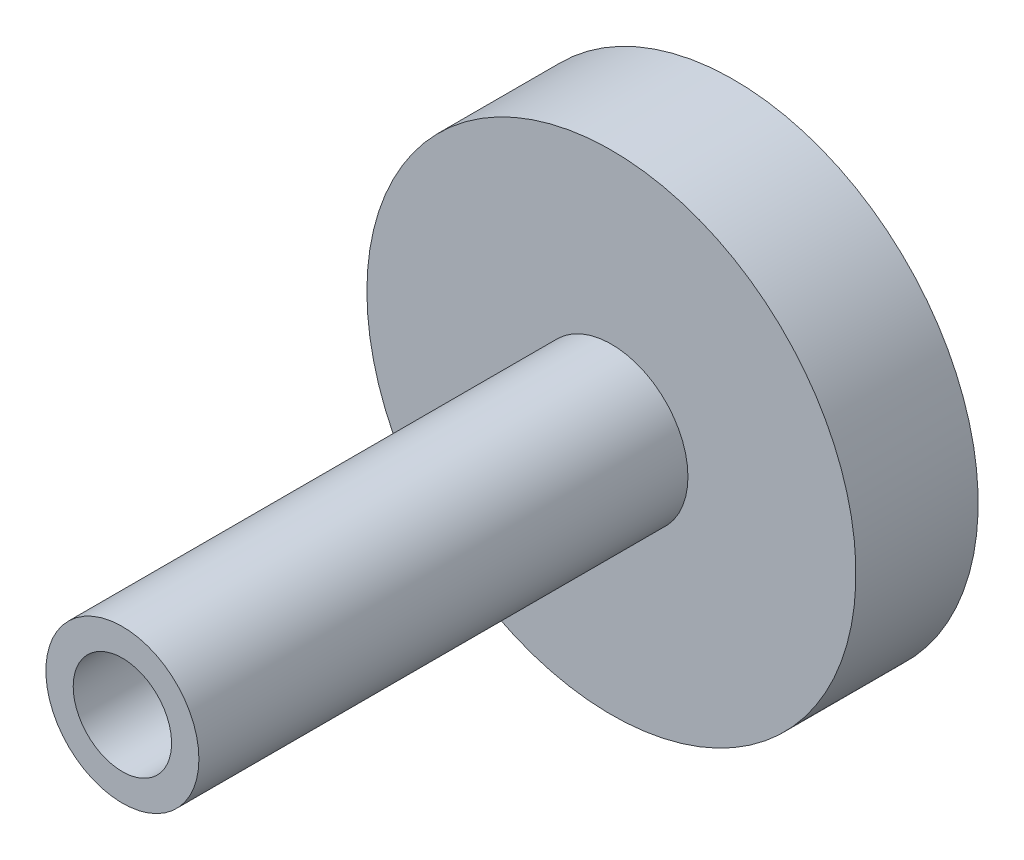
ISO-10303-21;
HEADER;
FILE_DESCRIPTION(('STEP AP214'),'2;1');
FILE_NAME('part.step','',(''),(''),'','','');
FILE_SCHEMA(('AUTOMOTIVE_DESIGN { 1 0 10303 214 1 1 1 1 }'));
ENDSEC;
DATA;
#1=APPLICATION_CONTEXT('core data for automotive mechanical design processes');
#2=APPLICATION_PROTOCOL_DEFINITION('international standard','automotive_design',2000,#1);
#3=PRODUCT_CONTEXT('',#1,'mechanical');
#4=PRODUCT('Part','Part','',(#3));
#5=PRODUCT_RELATED_PRODUCT_CATEGORY('part','',(#4));
#6=PRODUCT_DEFINITION_FORMATION('','',#4);
#7=PRODUCT_DEFINITION_CONTEXT('part definition',#1,'design');
#8=PRODUCT_DEFINITION('design','',#6,#7);
#9=PRODUCT_DEFINITION_SHAPE('','',#8);
#10=(LENGTH_UNIT() NAMED_UNIT(*) SI_UNIT(.MILLI.,.METRE.));
#11=(NAMED_UNIT(*) PLANE_ANGLE_UNIT() SI_UNIT($,.RADIAN.));
#12=(NAMED_UNIT(*) SI_UNIT($,.STERADIAN.) SOLID_ANGLE_UNIT());
#13=UNCERTAINTY_MEASURE_WITH_UNIT(LENGTH_MEASURE(1.E-05),#10,'distance_accuracy_value','');
#14=(GEOMETRIC_REPRESENTATION_CONTEXT(3) GLOBAL_UNCERTAINTY_ASSIGNED_CONTEXT((#13)) GLOBAL_UNIT_ASSIGNED_CONTEXT((#10,
#11,#12)) REPRESENTATION_CONTEXT('',''));
#15=CARTESIAN_POINT('',(0.,0.,0.));
#16=DIRECTION('',(0.,0.,1.));
#17=DIRECTION('',(1.,0.,0.));
#18=AXIS2_PLACEMENT_3D('',#15,#16,#17);
#19=CARTESIAN_POINT('',(0.,0.,31.7499999999997));
#20=DIRECTION('',(0.,0.,0.999999999999995));
#21=DIRECTION('',(1.,0.,0.));
#22=AXIS2_PLACEMENT_3D('',#19,#20,#21);
#23=PLANE('',#22);
#24=CARTESIAN_POINT('',(0.,0.,31.7499999999997));
#25=DIRECTION('',(0.,0.,0.999999999999995));
#26=DIRECTION('',(1.,0.,0.));
#27=AXIS2_PLACEMENT_3D('',#24,#25,#26);
#28=CIRCLE('',#27,2.555);
#29=CARTESIAN_POINT('',(-2.55500000000001,0.,31.7499999999997));
#30=VERTEX_POINT('',#29);
#31=EDGE_CURVE('E43',#30,#30,#28,.T.);
#32=ORIENTED_EDGE('',*,*,#31,.F.);
#33=EDGE_LOOP('',(#32));
#34=FACE_BOUND('',#33,.T.);
#35=CARTESIAN_POINT('',(0.,0.,31.7499999999997));
#36=DIRECTION('',(0.,0.,0.999999999999995));
#37=DIRECTION('',(1.,0.,0.));
#38=AXIS2_PLACEMENT_3D('',#35,#36,#37);
#39=CIRCLE('',#38,3.9751);
#40=CARTESIAN_POINT('',(3.97510000000002,0.,31.7499999999997));
#41=VERTEX_POINT('',#40);
#42=EDGE_CURVE('E57',#41,#41,#39,.T.);
#43=ORIENTED_EDGE('',*,*,#42,.T.);
#44=EDGE_LOOP('',(#43));
#45=FACE_BOUND('',#44,.T.);
#46=ADVANCED_FACE('F36',(#34,#45),#23,.T.);
#47=CARTESIAN_POINT('',(0.,0.,31.7499999999997));
#48=DIRECTION('',(0.,0.,-0.999999999999995));
#49=DIRECTION('',(-1.,0.,0.));
#50=AXIS2_PLACEMENT_3D('',#47,#48,#49);
#51=CYLINDRICAL_SURFACE('',#50,12.7);
#52=CARTESIAN_POINT('',(0.,0.,0.));
#53=DIRECTION('',(0.,0.,0.999999999999995));
#54=DIRECTION('',(1.,0.,0.));
#55=AXIS2_PLACEMENT_3D('',#52,#53,#54);
#56=CIRCLE('',#55,12.7);
#57=CARTESIAN_POINT('',(-12.7000000000001,0.,0.));
#58=VERTEX_POINT('',#57);
#59=EDGE_CURVE('E10',#58,#58,#56,.T.);
#60=CARTESIAN_POINT('',(0.,0.,6.34999999999999));
#61=DIRECTION('',(0.,0.,0.999999999999995));
#62=DIRECTION('',(1.,0.,0.));
#63=AXIS2_PLACEMENT_3D('',#60,#61,#62);
#64=CIRCLE('',#63,12.7);
#65=CARTESIAN_POINT('',(-12.7000000000001,0.,6.34999999999999));
#66=VERTEX_POINT('',#65);
#67=EDGE_CURVE('E52',#66,#66,#64,.T.);
#68=CARTESIAN_POINT('',(-12.7000000000001,0.,0.));
#69=CARTESIAN_POINT('',(-12.7000000000001,0.,0.0661458333333341));
#70=CARTESIAN_POINT('',(-12.7000000000001,0.,0.132291666666668));
#71=CARTESIAN_POINT('',(-12.7000000000001,0.,0.264583333333337));
#72=CARTESIAN_POINT('',(-12.7000000000001,0.,0.330729166666671));
#73=CARTESIAN_POINT('',(-12.7000000000001,0.,0.463020833333337));
#74=CARTESIAN_POINT('',(-12.7000000000001,0.,0.529166666666668));
#75=CARTESIAN_POINT('',(-12.7000000000001,0.,0.661458333333334));
#76=CARTESIAN_POINT('',(-12.7000000000001,0.,0.727604166666669));
#77=CARTESIAN_POINT('',(-12.7000000000001,0.,0.859895833333336));
#78=CARTESIAN_POINT('',(-12.7000000000001,0.,0.926041666666669));
#79=CARTESIAN_POINT('',(-12.7000000000001,0.,1.05833333333333));
#80=CARTESIAN_POINT('',(-12.7000000000001,0.,1.12447916666667));
#81=CARTESIAN_POINT('',(-12.7000000000001,0.,1.25677083333333));
#82=CARTESIAN_POINT('',(-12.7000000000001,0.,1.32291666666667));
#83=CARTESIAN_POINT('',(-12.7000000000001,0.,1.45520833333333));
#84=CARTESIAN_POINT('',(-12.7000000000001,0.,1.52135416666667));
#85=CARTESIAN_POINT('',(-12.7000000000001,0.,1.65364583333333));
#86=CARTESIAN_POINT('',(-12.7000000000001,0.,1.71979166666667));
#87=CARTESIAN_POINT('',(-12.7000000000001,0.,1.85208333333333));
#88=CARTESIAN_POINT('',(-12.7000000000001,0.,1.91822916666667));
#89=CARTESIAN_POINT('',(-12.7000000000001,0.,2.05052083333333));
#90=CARTESIAN_POINT('',(-12.7000000000001,0.,2.11666666666666));
#91=CARTESIAN_POINT('',(-12.7000000000001,0.,2.24895833333333));
#92=CARTESIAN_POINT('',(-12.7000000000001,0.,2.31510416666666));
#93=CARTESIAN_POINT('',(-12.7000000000001,0.,2.44739583333333));
#94=CARTESIAN_POINT('',(-12.7000000000001,0.,2.51354166666667));
#95=CARTESIAN_POINT('',(-12.7000000000001,0.,2.64583333333333));
#96=CARTESIAN_POINT('',(-12.7000000000001,0.,2.71197916666667));
#97=CARTESIAN_POINT('',(-12.7000000000001,0.,2.84427083333333));
#98=CARTESIAN_POINT('',(-12.7000000000001,0.,2.91041666666666));
#99=CARTESIAN_POINT('',(-12.7000000000001,0.,3.04270833333333));
#100=CARTESIAN_POINT('',(-12.7000000000001,0.,3.10885416666666));
#101=CARTESIAN_POINT('',(-12.7000000000001,0.,3.24114583333333));
#102=CARTESIAN_POINT('',(-12.7000000000001,0.,3.30729166666667));
#103=CARTESIAN_POINT('',(-12.7000000000001,0.,3.43958333333333));
#104=CARTESIAN_POINT('',(-12.7000000000001,0.,3.50572916666666));
#105=CARTESIAN_POINT('',(-12.7000000000001,0.,3.63802083333333));
#106=CARTESIAN_POINT('',(-12.7000000000001,0.,3.70416666666666));
#107=CARTESIAN_POINT('',(-12.7000000000001,0.,3.83645833333333));
#108=CARTESIAN_POINT('',(-12.7000000000001,0.,3.90260416666666));
#109=CARTESIAN_POINT('',(-12.7000000000001,0.,4.03489583333333));
#110=CARTESIAN_POINT('',(-12.7000000000001,0.,4.10104166666666));
#111=CARTESIAN_POINT('',(-12.7000000000001,0.,4.23333333333333));
#112=CARTESIAN_POINT('',(-12.7000000000001,0.,4.29947916666666));
#113=CARTESIAN_POINT('',(-12.7000000000001,0.,4.43177083333333));
#114=CARTESIAN_POINT('',(-12.7000000000001,0.,4.49791666666666));
#115=CARTESIAN_POINT('',(-12.7000000000001,0.,4.63020833333333));
#116=CARTESIAN_POINT('',(-12.7000000000001,0.,4.69635416666666));
#117=CARTESIAN_POINT('',(-12.7000000000001,0.,4.82864583333333));
#118=CARTESIAN_POINT('',(-12.7000000000001,0.,4.89479166666666));
#119=CARTESIAN_POINT('',(-12.7000000000001,0.,5.02708333333333));
#120=CARTESIAN_POINT('',(-12.7000000000001,0.,5.09322916666666));
#121=CARTESIAN_POINT('',(-12.7000000000001,0.,5.22552083333333));
#122=CARTESIAN_POINT('',(-12.7000000000001,0.,5.29166666666666));
#123=CARTESIAN_POINT('',(-12.7000000000001,0.,5.42395833333333));
#124=CARTESIAN_POINT('',(-12.7000000000001,0.,5.49010416666666));
#125=CARTESIAN_POINT('',(-12.7000000000001,0.,5.62239583333333));
#126=CARTESIAN_POINT('',(-12.7000000000001,0.,5.68854166666666));
#127=CARTESIAN_POINT('',(-12.7000000000001,0.,5.82083333333333));
#128=CARTESIAN_POINT('',(-12.7000000000001,0.,5.88697916666666));
#129=CARTESIAN_POINT('',(-12.7000000000001,0.,6.01927083333333));
#130=CARTESIAN_POINT('',(-12.7000000000001,0.,6.08541666666666));
#131=CARTESIAN_POINT('',(-12.7000000000001,0.,6.21770833333332));
#132=CARTESIAN_POINT('',(-12.7000000000001,0.,6.28385416666666));
#133=CARTESIAN_POINT('',(-12.7000000000001,0.,6.34999999999999));
#134=B_SPLINE_CURVE_WITH_KNOTS('',3,(#68,#69,#70,#71,#72,#73,#74,#75,#76,#77,#78,#79,#80,#81,
#82,#83,#84,#85,#86,#87,#88,#89,#90,#91,#92,#93,#94,#95,#96,#97,#98,#99,#100,#101,#102,#103,
#104,#105,#106,#107,#108,#109,#110,#111,#112,#113,#114,#115,#116,#117,#118,#119,#120,#121,#122,
#123,#124,#125,#126,#127,#128,#129,#130,#131,#132,#133),.UNSPECIFIED.,.F.,.F.,(4,2,2,2,2,2,2,2,
2,2,2,2,2,2,2,2,2,2,2,2,2,2,2,2,2,2,2,2,2,2,2,2,4),(0.,0.198437500000002,0.396875000000005,
0.5953125,0.793750000000003,0.992187500000002,1.190625,1.3890625,1.5875,1.7859375,1.984375,
2.1828125,2.38125,2.5796875,2.778125,2.97656249999999,3.175,3.3734375,3.571875,3.77031249999999,
3.96875,4.1671875,4.36562499999999,4.56406249999999,4.76249999999999,4.96093749999999,
5.15937499999999,5.35781249999999,5.55624999999999,5.75468749999999,5.95312499999999,
6.15156249999999,6.34999999999999),.UNSPECIFIED.);
#135=EDGE_CURVE('BSEAM38',#58,#66,#134,.T.);
#136=ORIENTED_EDGE('',*,*,#59,.T.);
#137=ORIENTED_EDGE('',*,*,#67,.F.);
#138=ORIENTED_EDGE('',*,*,#135,.T.);
#139=ORIENTED_EDGE('',*,*,#135,.F.);
#140=EDGE_LOOP('',(#136,#138,#137,#139));
#141=FACE_BOUND('',#140,.T.);
#142=ADVANCED_FACE('F38',(#141),#51,.T.);
#143=CARTESIAN_POINT('',(0.,0.,0.));
#144=DIRECTION('',(0.,0.,0.999999999999995));
#145=DIRECTION('',(1.,0.,0.));
#146=AXIS2_PLACEMENT_3D('',#143,#144,#145);
#147=PLANE('',#146);
#148=ORIENTED_EDGE('',*,*,#59,.F.);
#149=EDGE_LOOP('',(#148));
#150=FACE_BOUND('',#149,.T.);
#151=CARTESIAN_POINT('',(0.,0.,0.));
#152=DIRECTION('',(0.,0.,0.999999999999995));
#153=DIRECTION('',(1.,0.,0.));
#154=AXIS2_PLACEMENT_3D('',#151,#152,#153);
#155=CIRCLE('',#154,2.555);
#156=CARTESIAN_POINT('',(-2.55500000000001,0.,0.));
#157=VERTEX_POINT('',#156);
#158=EDGE_CURVE('E47',#157,#157,#155,.T.);
#159=ORIENTED_EDGE('',*,*,#158,.T.);
#160=EDGE_LOOP('',(#159));
#161=FACE_BOUND('',#160,.T.);
#162=ADVANCED_FACE('F74',(#150,#161),#147,.F.);
#163=CARTESIAN_POINT('',(0.,0.,31.7499999999997));
#164=DIRECTION('',(0.,0.,-0.999999999999995));
#165=DIRECTION('',(-1.,0.,0.));
#166=AXIS2_PLACEMENT_3D('',#163,#164,#165);
#167=CYLINDRICAL_SURFACE('',#166,2.555);
#168=CARTESIAN_POINT('',(-2.55500000000001,0.,31.7499999999997));
#169=CARTESIAN_POINT('',(-2.55500000000001,0.,31.419270833333));
#170=CARTESIAN_POINT('',(-2.55500000000001,0.,31.0885416666663));
#171=CARTESIAN_POINT('',(-2.55500000000001,0.,30.427083333333));
#172=CARTESIAN_POINT('',(-2.55500000000001,0.,30.0963541666663));
#173=CARTESIAN_POINT('',(-2.55500000000001,0.,29.434895833333));
#174=CARTESIAN_POINT('',(-2.55500000000001,0.,29.1041666666664));
#175=CARTESIAN_POINT('',(-2.55500000000001,0.,28.442708333333));
#176=CARTESIAN_POINT('',(-2.55500000000001,0.,28.1119791666664));
#177=CARTESIAN_POINT('',(-2.55500000000001,0.,27.450520833333));
#178=CARTESIAN_POINT('',(-2.55500000000001,0.,27.1197916666664));
#179=CARTESIAN_POINT('',(-2.55500000000001,0.,26.4583333333331));
#180=CARTESIAN_POINT('',(-2.55500000000001,0.,26.1276041666664));
#181=CARTESIAN_POINT('',(-2.55500000000001,0.,25.4661458333331));
#182=CARTESIAN_POINT('',(-2.55500000000001,0.,25.1354166666664));
#183=CARTESIAN_POINT('',(-2.55500000000001,0.,24.4739583333331));
#184=CARTESIAN_POINT('',(-2.55500000000001,0.,24.1432291666664));
#185=CARTESIAN_POINT('',(-2.55500000000001,0.,23.4817708333331));
#186=CARTESIAN_POINT('',(-2.55500000000001,0.,23.1510416666664));
#187=CARTESIAN_POINT('',(-2.55500000000001,0.,22.4895833333331));
#188=CARTESIAN_POINT('',(-2.55500000000001,0.,22.1588541666664));
#189=CARTESIAN_POINT('',(-2.55500000000001,0.,21.4973958333331));
#190=CARTESIAN_POINT('',(-2.55500000000001,0.,21.1666666666664));
#191=CARTESIAN_POINT('',(-2.55500000000001,0.,20.5052083333331));
#192=CARTESIAN_POINT('',(-2.55500000000001,0.,20.1744791666665));
#193=CARTESIAN_POINT('',(-2.55500000000001,0.,19.5130208333331));
#194=CARTESIAN_POINT('',(-2.55500000000001,0.,19.1822916666665));
#195=CARTESIAN_POINT('',(-2.55500000000001,0.,18.5208333333331));
#196=CARTESIAN_POINT('',(-2.55500000000001,0.,18.1901041666665));
#197=CARTESIAN_POINT('',(-2.55500000000001,0.,17.5286458333332));
#198=CARTESIAN_POINT('',(-2.55500000000001,0.,17.1979166666665));
#199=CARTESIAN_POINT('',(-2.55500000000001,0.,16.5364583333332));
#200=CARTESIAN_POINT('',(-2.55500000000001,0.,16.2057291666665));
#201=CARTESIAN_POINT('',(-2.55500000000001,0.,15.5442708333332));
#202=CARTESIAN_POINT('',(-2.55500000000001,0.,15.2135416666665));
#203=CARTESIAN_POINT('',(-2.55500000000001,0.,14.5520833333332));
#204=CARTESIAN_POINT('',(-2.55500000000001,0.,14.2213541666665));
#205=CARTESIAN_POINT('',(-2.55500000000001,0.,13.5598958333332));
#206=CARTESIAN_POINT('',(-2.55500000000001,0.,13.2291666666665));
#207=CARTESIAN_POINT('',(-2.55500000000001,0.,12.5677083333332));
#208=CARTESIAN_POINT('',(-2.55500000000001,0.,12.2369791666665));
#209=CARTESIAN_POINT('',(-2.55500000000001,0.,11.5755208333332));
#210=CARTESIAN_POINT('',(-2.55500000000001,0.,11.2447916666666));
#211=CARTESIAN_POINT('',(-2.55500000000001,0.,10.5833333333332));
#212=CARTESIAN_POINT('',(-2.55500000000001,0.,10.2526041666666));
#213=CARTESIAN_POINT('',(-2.55500000000001,0.,9.59114583333324));
#214=CARTESIAN_POINT('',(-2.55500000000001,0.,9.26041666666657));
#215=CARTESIAN_POINT('',(-2.55500000000001,0.,8.59895833333325));
#216=CARTESIAN_POINT('',(-2.55500000000001,0.,8.26822916666659));
#217=CARTESIAN_POINT('',(-2.55500000000001,0.,7.60677083333326));
#218=CARTESIAN_POINT('',(-2.55500000000001,0.,7.2760416666666));
#219=CARTESIAN_POINT('',(-2.55500000000001,0.,6.61458333333327));
#220=CARTESIAN_POINT('',(-2.55500000000001,0.,6.28385416666661));
#221=CARTESIAN_POINT('',(-2.55500000000001,0.,5.62239583333328));
#222=CARTESIAN_POINT('',(-2.55500000000001,0.,5.29166666666662));
#223=CARTESIAN_POINT('',(-2.55500000000001,0.,4.63020833333329));
#224=CARTESIAN_POINT('',(-2.55500000000001,0.,4.29947916666663));
#225=CARTESIAN_POINT('',(-2.55500000000001,0.,3.6380208333333));
#226=CARTESIAN_POINT('',(-2.55500000000001,0.,3.30729166666664));
#227=CARTESIAN_POINT('',(-2.55500000000001,0.,2.64583333333331));
#228=CARTESIAN_POINT('',(-2.55500000000001,0.,2.31510416666665));
#229=CARTESIAN_POINT('',(-2.55500000000001,0.,1.65364583333332));
#230=CARTESIAN_POINT('',(-2.55500000000001,0.,1.32291666666666));
#231=CARTESIAN_POINT('',(-2.55500000000001,0.,0.66145833333333));
#232=CARTESIAN_POINT('',(-2.55500000000001,0.,0.330729166666664));
#233=CARTESIAN_POINT('',(-2.55500000000001,0.,0.));
#234=B_SPLINE_CURVE_WITH_KNOTS('',3,(#168,#169,#170,#171,#172,#173,#174,#175,#176,#177,#178,
#179,#180,#181,#182,#183,#184,#185,#186,#187,#188,#189,#190,#191,#192,#193,#194,#195,#196,#197,
#198,#199,#200,#201,#202,#203,#204,#205,#206,#207,#208,#209,#210,#211,#212,#213,#214,#215,#216,
#217,#218,#219,#220,#221,#222,#223,#224,#225,#226,#227,#228,#229,#230,#231,#232,#233),
.UNSPECIFIED.,.F.,.F.,(4,2,2,2,2,2,2,2,2,2,2,2,2,2,2,2,2,2,2,2,2,2,2,2,2,2,2,2,2,2,2,2,4),(0.,
0.992187499999984,1.98437499999998,2.97656249999996,3.96874999999996,4.96093749999994,
5.95312499999993,6.94531249999992,7.93749999999991,8.9296874999999,9.92187499999989,
10.9140624999999,11.9062499999999,12.8984374999999,13.8906249999998,14.8828124999998,
15.8749999999998,16.8671874999998,17.8593749999998,18.8515624999998,19.8437499999998,
20.8359374999998,21.8281249999998,22.8203124999998,23.8124999999997,24.8046874999997,
25.7968749999997,26.7890624999997,27.7812499999997,28.7734374999997,29.7656249999997,
30.7578124999997,31.7499999999997),.UNSPECIFIED.);
#235=EDGE_CURVE('BSEAM69',#30,#157,#234,.T.);
#236=ORIENTED_EDGE('',*,*,#31,.T.);
#237=ORIENTED_EDGE('',*,*,#158,.F.);
#238=ORIENTED_EDGE('',*,*,#235,.T.);
#239=ORIENTED_EDGE('',*,*,#235,.F.);
#240=EDGE_LOOP('',(#236,#238,#237,#239));
#241=FACE_BOUND('',#240,.T.);
#242=ADVANCED_FACE('F69',(#241),#167,.F.);
#243=CARTESIAN_POINT('',(0.,0.,6.34999999999999));
#244=DIRECTION('',(0.,0.,0.999999999999995));
#245=DIRECTION('',(1.,0.,0.));
#246=AXIS2_PLACEMENT_3D('',#243,#244,#245);
#247=PLANE('',#246);
#248=CARTESIAN_POINT('',(0.,0.,6.34999999999999));
#249=DIRECTION('',(0.,0.,0.999999999999995));
#250=DIRECTION('',(1.,0.,0.));
#251=AXIS2_PLACEMENT_3D('',#248,#249,#250);
#252=CIRCLE('',#251,3.9751);
#253=CARTESIAN_POINT('',(3.97510000000002,0.,6.34999999999999));
#254=VERTEX_POINT('',#253);
#255=EDGE_CURVE('E56',#254,#254,#252,.T.);
#256=ORIENTED_EDGE('',*,*,#255,.F.);
#257=EDGE_LOOP('',(#256));
#258=FACE_BOUND('',#257,.T.);
#259=ORIENTED_EDGE('',*,*,#67,.T.);
#260=EDGE_LOOP('',(#259));
#261=FACE_BOUND('',#260,.T.);
#262=ADVANCED_FACE('F66',(#258,#261),#247,.T.);
#263=CARTESIAN_POINT('',(0.,0.,6.34999999999999));
#264=DIRECTION('',(0.,0.,0.999999999999995));
#265=DIRECTION('',(1.,0.,0.));
#266=AXIS2_PLACEMENT_3D('',#263,#264,#265);
#267=CYLINDRICAL_SURFACE('',#266,3.9751);
#268=CARTESIAN_POINT('',(3.97510000000002,0.,6.34999999999999));
#269=CARTESIAN_POINT('',(3.97510000000002,0.,6.61458333333332));
#270=CARTESIAN_POINT('',(3.97510000000002,0.,6.87916666666665));
#271=CARTESIAN_POINT('',(3.97510000000002,0.,7.40833333333331));
#272=CARTESIAN_POINT('',(3.97510000000002,0.,7.67291666666664));
#273=CARTESIAN_POINT('',(3.97510000000002,0.,8.2020833333333));
#274=CARTESIAN_POINT('',(3.97510000000002,0.,8.46666666666663));
#275=CARTESIAN_POINT('',(3.97510000000002,0.,8.99583333333329));
#276=CARTESIAN_POINT('',(3.97510000000002,0.,9.26041666666662));
#277=CARTESIAN_POINT('',(3.97510000000002,0.,9.78958333333328));
#278=CARTESIAN_POINT('',(3.97510000000002,0.,10.0541666666666));
#279=CARTESIAN_POINT('',(3.97510000000002,0.,10.5833333333333));
#280=CARTESIAN_POINT('',(3.97510000000002,0.,10.8479166666666));
#281=CARTESIAN_POINT('',(3.97510000000002,0.,11.3770833333333));
#282=CARTESIAN_POINT('',(3.97510000000002,0.,11.6416666666666));
#283=CARTESIAN_POINT('',(3.97510000000002,0.,12.1708333333333));
#284=CARTESIAN_POINT('',(3.97510000000002,0.,12.4354166666666));
#285=CARTESIAN_POINT('',(3.97510000000002,0.,12.9645833333332));
#286=CARTESIAN_POINT('',(3.97510000000002,0.,13.2291666666666));
#287=CARTESIAN_POINT('',(3.97510000000002,0.,13.7583333333332));
#288=CARTESIAN_POINT('',(3.97510000000002,0.,14.0229166666666));
#289=CARTESIAN_POINT('',(3.97510000000002,0.,14.5520833333332));
#290=CARTESIAN_POINT('',(3.97510000000002,0.,14.8166666666666));
#291=CARTESIAN_POINT('',(3.97510000000002,0.,15.3458333333332));
#292=CARTESIAN_POINT('',(3.97510000000002,0.,15.6104166666665));
#293=CARTESIAN_POINT('',(3.97510000000002,0.,16.1395833333332));
#294=CARTESIAN_POINT('',(3.97510000000002,0.,16.4041666666665));
#295=CARTESIAN_POINT('',(3.97510000000002,0.,16.9333333333332));
#296=CARTESIAN_POINT('',(3.97510000000002,0.,17.1979166666665));
#297=CARTESIAN_POINT('',(3.97510000000002,0.,17.7270833333332));
#298=CARTESIAN_POINT('',(3.97510000000002,0.,17.9916666666665));
#299=CARTESIAN_POINT('',(3.97510000000002,0.,18.5208333333332));
#300=CARTESIAN_POINT('',(3.97510000000002,0.,18.7854166666665));
#301=CARTESIAN_POINT('',(3.97510000000002,0.,19.3145833333332));
#302=CARTESIAN_POINT('',(3.97510000000002,0.,19.5791666666665));
#303=CARTESIAN_POINT('',(3.97510000000002,0.,20.1083333333331));
#304=CARTESIAN_POINT('',(3.97510000000002,0.,20.3729166666665));
#305=CARTESIAN_POINT('',(3.97510000000002,0.,20.9020833333331));
#306=CARTESIAN_POINT('',(3.97510000000002,0.,21.1666666666665));
#307=CARTESIAN_POINT('',(3.97510000000002,0.,21.6958333333331));
#308=CARTESIAN_POINT('',(3.97510000000002,0.,21.9604166666665));
#309=CARTESIAN_POINT('',(3.97510000000002,0.,22.4895833333331));
#310=CARTESIAN_POINT('',(3.97510000000002,0.,22.7541666666664));
#311=CARTESIAN_POINT('',(3.97510000000002,0.,23.2833333333331));
#312=CARTESIAN_POINT('',(3.97510000000002,0.,23.5479166666664));
#313=CARTESIAN_POINT('',(3.97510000000002,0.,24.0770833333331));
#314=CARTESIAN_POINT('',(3.97510000000002,0.,24.3416666666664));
#315=CARTESIAN_POINT('',(3.97510000000002,0.,24.8708333333331));
#316=CARTESIAN_POINT('',(3.97510000000002,0.,25.1354166666664));
#317=CARTESIAN_POINT('',(3.97510000000002,0.,25.6645833333331));
#318=CARTESIAN_POINT('',(3.97510000000002,0.,25.9291666666664));
#319=CARTESIAN_POINT('',(3.97510000000002,0.,26.4583333333331));
#320=CARTESIAN_POINT('',(3.97510000000002,0.,26.7229166666664));
#321=CARTESIAN_POINT('',(3.97510000000002,0.,27.2520833333331));
#322=CARTESIAN_POINT('',(3.97510000000002,0.,27.5166666666664));
#323=CARTESIAN_POINT('',(3.97510000000002,0.,28.045833333333));
#324=CARTESIAN_POINT('',(3.97510000000002,0.,28.3104166666664));
#325=CARTESIAN_POINT('',(3.97510000000002,0.,28.839583333333));
#326=CARTESIAN_POINT('',(3.97510000000002,0.,29.1041666666664));
#327=CARTESIAN_POINT('',(3.97510000000002,0.,29.633333333333));
#328=CARTESIAN_POINT('',(3.97510000000002,0.,29.8979166666664));
#329=CARTESIAN_POINT('',(3.97510000000002,0.,30.427083333333));
#330=CARTESIAN_POINT('',(3.97510000000002,0.,30.6916666666663));
#331=CARTESIAN_POINT('',(3.97510000000002,0.,31.220833333333));
#332=CARTESIAN_POINT('',(3.97510000000002,0.,31.4854166666663));
#333=CARTESIAN_POINT('',(3.97510000000002,0.,31.7499999999997));
#334=B_SPLINE_CURVE_WITH_KNOTS('',3,(#268,#269,#270,#271,#272,#273,#274,#275,#276,#277,#278,
#279,#280,#281,#282,#283,#284,#285,#286,#287,#288,#289,#290,#291,#292,#293,#294,#295,#296,#297,
#298,#299,#300,#301,#302,#303,#304,#305,#306,#307,#308,#309,#310,#311,#312,#313,#314,#315,#316,
#317,#318,#319,#320,#321,#322,#323,#324,#325,#326,#327,#328,#329,#330,#331,#332,#333),
.UNSPECIFIED.,.F.,.F.,(4,2,2,2,2,2,2,2,2,2,2,2,2,2,2,2,2,2,2,2,2,2,2,2,2,2,2,2,2,2,2,2,4),(0.,
0.793749999999989,1.58749999999998,2.38124999999997,3.17499999999996,3.96874999999995,
4.76249999999994,5.55624999999993,6.34999999999992,7.14374999999991,7.9374999999999,
8.73124999999989,9.52499999999987,10.3187499999999,11.1124999999999,11.9062499999998,
12.6999999999998,13.4937499999998,14.2874999999998,15.0812499999998,15.8749999999998,
16.6687499999998,17.4624999999998,18.2562499999998,19.0499999999998,19.8437499999997,
20.6374999999997,21.4312499999997,22.2249999999997,23.0187499999997,23.8124999999997,
24.6062499999997,25.3999999999997),.UNSPECIFIED.);
#335=EDGE_CURVE('BSEAM63',#254,#41,#334,.T.);
#336=ORIENTED_EDGE('',*,*,#255,.T.);
#337=ORIENTED_EDGE('',*,*,#42,.F.);
#338=ORIENTED_EDGE('',*,*,#335,.T.);
#339=ORIENTED_EDGE('',*,*,#335,.F.);
#340=EDGE_LOOP('',(#336,#338,#337,#339));
#341=FACE_BOUND('',#340,.T.);
#342=ADVANCED_FACE('F63',(#341),#267,.T.);
#343=CLOSED_SHELL('',(#46,#142,#162,#242,#262,#342));
#344=MANIFOLD_SOLID_BREP('B2',#343);
#345=ADVANCED_BREP_SHAPE_REPRESENTATION('',(#18,#344),#14);
#346=SHAPE_DEFINITION_REPRESENTATION(#9,#345);
ENDSEC;
END-ISO-10303-21;
